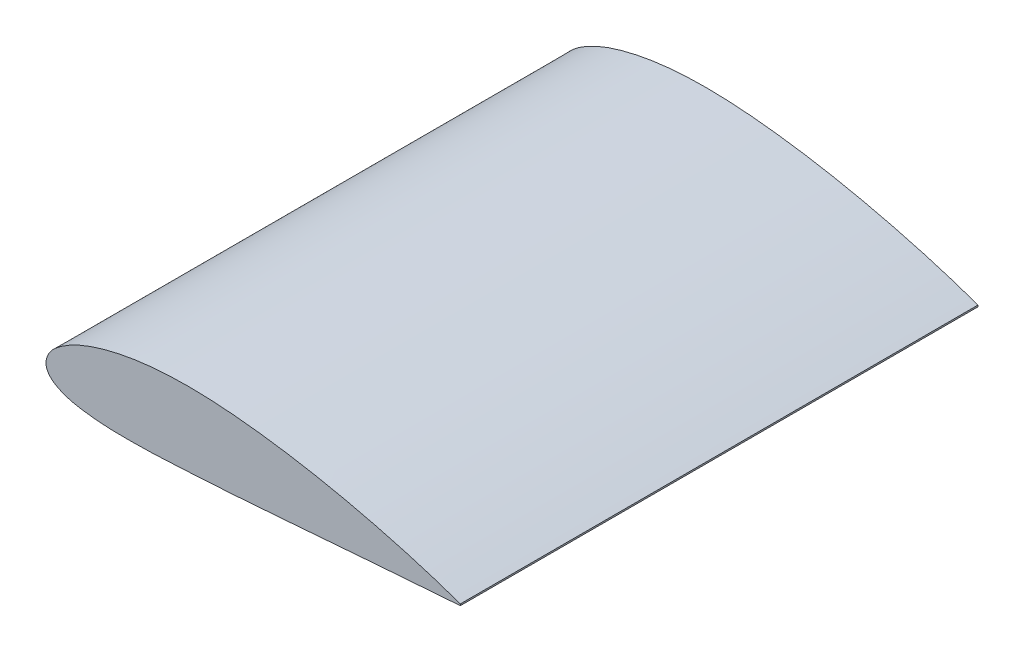
ISO-10303-21;
HEADER;
FILE_DESCRIPTION(('STEP AP214'),'2;1');
FILE_NAME('part.step','',(''),(''),'','','');
FILE_SCHEMA(('AUTOMOTIVE_DESIGN { 1 0 10303 214 1 1 1 1 }'));
ENDSEC;
DATA;
#1=APPLICATION_CONTEXT('core data for automotive mechanical design processes');
#2=APPLICATION_PROTOCOL_DEFINITION('international standard','automotive_design',2000,#1);
#3=PRODUCT_CONTEXT('',#1,'mechanical');
#4=PRODUCT('Part','Part','',(#3));
#5=PRODUCT_RELATED_PRODUCT_CATEGORY('part','',(#4));
#6=PRODUCT_DEFINITION_FORMATION('','',#4);
#7=PRODUCT_DEFINITION_CONTEXT('part definition',#1,'design');
#8=PRODUCT_DEFINITION('design','',#6,#7);
#9=PRODUCT_DEFINITION_SHAPE('','',#8);
#10=(LENGTH_UNIT() NAMED_UNIT(*) SI_UNIT(.MILLI.,.METRE.));
#11=(NAMED_UNIT(*) PLANE_ANGLE_UNIT() SI_UNIT($,.RADIAN.));
#12=(NAMED_UNIT(*) SI_UNIT($,.STERADIAN.) SOLID_ANGLE_UNIT());
#13=UNCERTAINTY_MEASURE_WITH_UNIT(LENGTH_MEASURE(1.E-05),#10,'distance_accuracy_value','');
#14=(GEOMETRIC_REPRESENTATION_CONTEXT(3) GLOBAL_UNCERTAINTY_ASSIGNED_CONTEXT((#13)) GLOBAL_UNIT_ASSIGNED_CONTEXT((#10,
#11,#12)) REPRESENTATION_CONTEXT('',''));
#15=CARTESIAN_POINT('',(0.,0.,0.));
#16=DIRECTION('',(0.,0.,1.));
#17=DIRECTION('',(1.,0.,0.));
#18=AXIS2_PLACEMENT_3D('',#15,#16,#17);
#19=CARTESIAN_POINT('',(100.,0.19,62.5));
#20=CARTESIAN_POINT('',(98.3360546419194,0.76484591452266,62.5));
#21=CARTESIAN_POINT('',(95.0208935644417,1.91014001454692,62.5));
#22=CARTESIAN_POINT('',(88.3728153631507,3.99119495998197,62.5));
#23=CARTESIAN_POINT('',(80.0503320648138,6.2750812076573,62.5));
#24=CARTESIAN_POINT('',(70.0445886554002,8.6136476352504,62.5));
#25=CARTESIAN_POINT('',(60.0386643804567,10.513538846848,62.5));
#26=CARTESIAN_POINT('',(50.0311040178423,11.9337905995866,62.5));
#27=CARTESIAN_POINT('',(40.0203446755458,12.8297283395815,62.5));
#28=CARTESIAN_POINT('',(31.6571382980835,12.9227163468173,62.5));
#29=CARTESIAN_POINT('',(24.9839241832814,12.4514246884447,62.5));
#30=CARTESIAN_POINT('',(19.9679673263382,11.7780132255189,62.5));
#31=CARTESIAN_POINT('',(14.9431956893952,10.7208152423679,62.5));
#32=CARTESIAN_POINT('',(10.7655921921213,9.46556819007456,62.5));
#33=CARTESIAN_POINT('',(7.45039380716086,8.07744812853414,62.5));
#34=CARTESIAN_POINT('',(4.90725257935843,6.76562454765211,62.5));
#35=CARTESIAN_POINT('',(2.78567518300562,5.31395587217279,62.5));
#36=CARTESIAN_POINT('',(0.678587456229065,3.3349382851458,62.5));
#37=CARTESIAN_POINT('',(-0.639700555191432,0.412131012393047,62.5));
#38=CARTESIAN_POINT('',(0.945805465840963,-2.01340442883506,62.5));
#39=CARTESIAN_POINT('',(2.81459736982895,-3.2367692079141,62.5));
#40=CARTESIAN_POINT('',(4.93387971444969,-4.11788448213044,62.5));
#41=CARTESIAN_POINT('',(7.48054281344165,-4.69867008328299,62.5));
#42=CARTESIAN_POINT('',(10.8179641055756,-5.20152468497258,62.5));
#43=CARTESIAN_POINT('',(14.9918712822611,-5.5599196034721,62.5));
#44=CARTESIAN_POINT('',(20.0002592854776,-5.56803006659069,62.5));
#45=CARTESIAN_POINT('',(25.0026998264743,-5.52793761176141,62.5));
#46=CARTESIAN_POINT('',(31.6681658450513,-5.17040107759097,62.5));
#47=CARTESIAN_POINT('',(40.0038115202688,-4.72505180246446,62.5));
#48=CARTESIAN_POINT('',(50.0039551460834,-4.03907277443699,62.5));
#49=CARTESIAN_POINT('',(60.0000387739362,-3.23720633833052,62.5));
#50=CARTESIAN_POINT('',(69.9998690866409,-2.45178374687352,62.5));
#51=CARTESIAN_POINT('',(79.9979173357133,-1.65586237855998,62.5));
#52=CARTESIAN_POINT('',(88.3343600440769,-1.06371301076697,62.5));
#53=CARTESIAN_POINT('',(94.9990695877566,-0.544106165645998,62.5));
#54=CARTESIAN_POINT('',(98.3331867825825,-0.308023805294868,62.5));
#55=CARTESIAN_POINT('',(100.,-0.19,62.5));
#56=B_SPLINE_CURVE_WITH_KNOTS('',3,(#19,#20,#21,#22,#23,#24,#25,#26,#27,#28,#29,#30,#31,#32,#33,
#34,#35,#36,#37,#38,#39,#40,#41,#42,#43,#44,#45,#46,#47,#48,#49,#50,#51,#52,#53,#54,#55),
.UNSPECIFIED.,.F.,.F.,(4,1,1,1,1,1,1,1,1,1,1,1,1,1,1,1,1,1,1,1,1,1,1,1,1,1,1,1,1,1,1,1,1,1,4),
(0.,0.0253650887246445,0.0505361275587217,0.100361870134764,0.149678338251287,0.198558599638479,
0.247063640993935,0.295266786262708,0.34329760014287,0.367374741168208,0.391610788770833,
0.416159496837379,0.441301925227276,0.454325483129524,0.467881590674856,0.482538596873547,
0.490995278488938,0.510026354241119,0.521805546317329,0.529147847458602,0.542208903153752,
0.554568661965215,0.566721378147277,0.590824996597648,0.614842324624285,0.638859652650922,
0.662900021742007,0.711005223100047,0.759146089619428,0.807321924518754,0.855501518205133,
0.903677353104459,0.951838628914161,0.975922858974662,1.),.UNSPECIFIED.);
#57=DIRECTION('',(0.,0.,-1.));
#58=VECTOR('',#57,1.);
#59=SURFACE_OF_LINEAR_EXTRUSION('',#56,#58);
#60=CARTESIAN_POINT('',(100.,0.19,-62.5));
#61=CARTESIAN_POINT('',(98.3360546419194,0.76484591452266,-62.5));
#62=CARTESIAN_POINT('',(95.0208935644417,1.91014001454692,-62.5));
#63=CARTESIAN_POINT('',(88.3728153631507,3.99119495998197,-62.5));
#64=CARTESIAN_POINT('',(80.0503320648138,6.2750812076573,-62.5));
#65=CARTESIAN_POINT('',(70.0445886554002,8.6136476352504,-62.5));
#66=CARTESIAN_POINT('',(60.0386643804567,10.513538846848,-62.5));
#67=CARTESIAN_POINT('',(50.0311040178423,11.9337905995866,-62.5));
#68=CARTESIAN_POINT('',(40.0203446755458,12.8297283395815,-62.5));
#69=CARTESIAN_POINT('',(31.6571382980835,12.9227163468173,-62.5));
#70=CARTESIAN_POINT('',(24.9839241832814,12.4514246884447,-62.5));
#71=CARTESIAN_POINT('',(19.9679673263382,11.7780132255189,-62.5));
#72=CARTESIAN_POINT('',(14.9431956893952,10.7208152423679,-62.5));
#73=CARTESIAN_POINT('',(10.7655921921213,9.46556819007456,-62.5));
#74=CARTESIAN_POINT('',(7.45039380716086,8.07744812853414,-62.5));
#75=CARTESIAN_POINT('',(4.90725257935843,6.76562454765211,-62.5));
#76=CARTESIAN_POINT('',(2.78567518300562,5.31395587217279,-62.5));
#77=CARTESIAN_POINT('',(0.678587456229065,3.3349382851458,-62.5));
#78=CARTESIAN_POINT('',(-0.639700555191432,0.412131012393047,-62.5));
#79=CARTESIAN_POINT('',(0.945805465840963,-2.01340442883506,-62.5));
#80=CARTESIAN_POINT('',(2.81459736982895,-3.2367692079141,-62.5));
#81=CARTESIAN_POINT('',(4.93387971444969,-4.11788448213044,-62.5));
#82=CARTESIAN_POINT('',(7.48054281344165,-4.69867008328299,-62.5));
#83=CARTESIAN_POINT('',(10.8179641055756,-5.20152468497258,-62.5));
#84=CARTESIAN_POINT('',(14.9918712822611,-5.5599196034721,-62.5));
#85=CARTESIAN_POINT('',(20.0002592854776,-5.56803006659069,-62.5));
#86=CARTESIAN_POINT('',(25.0026998264743,-5.52793761176141,-62.5));
#87=CARTESIAN_POINT('',(31.6681658450513,-5.17040107759097,-62.5));
#88=CARTESIAN_POINT('',(40.0038115202688,-4.72505180246446,-62.5));
#89=CARTESIAN_POINT('',(50.0039551460834,-4.03907277443699,-62.5));
#90=CARTESIAN_POINT('',(60.0000387739362,-3.23720633833052,-62.5));
#91=CARTESIAN_POINT('',(69.9998690866409,-2.45178374687352,-62.5));
#92=CARTESIAN_POINT('',(79.9979173357133,-1.65586237855998,-62.5));
#93=CARTESIAN_POINT('',(88.3343600440769,-1.06371301076697,-62.5));
#94=CARTESIAN_POINT('',(94.9990695877566,-0.544106165645998,-62.5));
#95=CARTESIAN_POINT('',(98.3331867825825,-0.308023805294868,-62.5));
#96=CARTESIAN_POINT('',(100.,-0.19,-62.5));
#97=B_SPLINE_CURVE_WITH_KNOTS('',3,(#60,#61,#62,#63,#64,#65,#66,#67,#68,#69,#70,#71,#72,#73,#74,
#75,#76,#77,#78,#79,#80,#81,#82,#83,#84,#85,#86,#87,#88,#89,#90,#91,#92,#93,#94,#95,#96),
.UNSPECIFIED.,.F.,.F.,(4,1,1,1,1,1,1,1,1,1,1,1,1,1,1,1,1,1,1,1,1,1,1,1,1,1,1,1,1,1,1,1,1,1,4),
(0.,0.0253650887246445,0.0505361275587217,0.100361870134764,0.149678338251287,0.198558599638479,
0.247063640993935,0.295266786262708,0.34329760014287,0.367374741168208,0.391610788770833,
0.416159496837379,0.441301925227276,0.454325483129524,0.467881590674856,0.482538596873547,
0.490995278488938,0.510026354241119,0.521805546317329,0.529147847458602,0.542208903153752,
0.554568661965215,0.566721378147277,0.590824996597648,0.614842324624285,0.638859652650922,
0.662900021742007,0.711005223100047,0.759146089619428,0.807321924518754,0.855501518205133,
0.903677353104459,0.951838628914161,0.975922858974662,1.),.UNSPECIFIED.);
#98=CARTESIAN_POINT('',(100.,0.19,-62.5));
#99=VERTEX_POINT('',#98);
#100=CARTESIAN_POINT('',(100.,-0.19,-62.5));
#101=VERTEX_POINT('',#100);
#102=EDGE_CURVE('E74',#99,#101,#97,.T.);
#103=ORIENTED_EDGE('',*,*,#102,.T.);
#104=DIRECTION('',(0.,0.,-1.));
#105=VECTOR('',#104,1.);
#106=CARTESIAN_POINT('',(100.,-0.19,62.5));
#107=LINE('',#106,#105);
#108=CARTESIAN_POINT('',(100.,-0.19,62.5));
#109=VERTEX_POINT('',#108);
#110=EDGE_CURVE('E11',#109,#101,#107,.T.);
#111=ORIENTED_EDGE('',*,*,#110,.F.);
#112=CARTESIAN_POINT('',(100.,0.19,62.5));
#113=VERTEX_POINT('',#112);
#114=EDGE_CURVE('E72',#113,#109,#56,.T.);
#115=ORIENTED_EDGE('',*,*,#114,.F.);
#116=DIRECTION('',(0.,0.,-1.));
#117=VECTOR('',#116,1.);
#118=CARTESIAN_POINT('',(100.,0.19,62.5));
#119=LINE('',#118,#117);
#120=EDGE_CURVE('E49',#113,#99,#119,.T.);
#121=ORIENTED_EDGE('',*,*,#120,.T.);
#122=EDGE_LOOP('',(#103,#111,#115,#121));
#123=FACE_BOUND('',#122,.T.);
#124=ADVANCED_FACE('F41',(#123),#59,.F.);
#125=CARTESIAN_POINT('',(100.,0.19,62.5));
#126=DIRECTION('',(-1.,0.,0.));
#127=DIRECTION('',(0.,0.,1.));
#128=AXIS2_PLACEMENT_3D('',#125,#126,#127);
#129=PLANE('',#128);
#130=DIRECTION('',(0.,1.,0.));
#131=VECTOR('',#130,1.);
#132=CARTESIAN_POINT('',(100.,0.19,-62.5));
#133=LINE('',#132,#131);
#134=EDGE_CURVE('E61',#101,#99,#133,.T.);
#135=ORIENTED_EDGE('',*,*,#134,.T.);
#136=ORIENTED_EDGE('',*,*,#120,.F.);
#137=DIRECTION('',(0.,1.,0.));
#138=VECTOR('',#137,1.);
#139=CARTESIAN_POINT('',(100.,0.19,62.5));
#140=LINE('',#139,#138);
#141=EDGE_CURVE('E60',#109,#113,#140,.T.);
#142=ORIENTED_EDGE('',*,*,#141,.F.);
#143=ORIENTED_EDGE('',*,*,#110,.T.);
#144=EDGE_LOOP('',(#135,#136,#142,#143));
#145=FACE_BOUND('',#144,.T.);
#146=ADVANCED_FACE('F69',(#145),#129,.F.);
#147=CARTESIAN_POINT('',(0.251862902669803,2.07183778007467,62.5));
#148=DIRECTION('',(0.,0.,-1.));
#149=DIRECTION('',(-1.,0.,0.));
#150=AXIS2_PLACEMENT_3D('',#147,#148,#149);
#151=PLANE('',#150);
#152=ORIENTED_EDGE('',*,*,#114,.T.);
#153=ORIENTED_EDGE('',*,*,#141,.T.);
#154=EDGE_LOOP('',(#152,#153));
#155=FACE_BOUND('',#154,.T.);
#156=ADVANCED_FACE('F89',(#155),#151,.F.);
#157=CARTESIAN_POINT('',(0.251862902669803,2.07183778007467,-62.5));
#158=DIRECTION('',(0.,0.,-1.));
#159=DIRECTION('',(-1.,0.,0.));
#160=AXIS2_PLACEMENT_3D('',#157,#158,#159);
#161=PLANE('',#160);
#162=ORIENTED_EDGE('',*,*,#102,.F.);
#163=ORIENTED_EDGE('',*,*,#134,.F.);
#164=EDGE_LOOP('',(#162,#163));
#165=FACE_BOUND('',#164,.T.);
#166=ADVANCED_FACE('F77',(#165),#161,.T.);
#167=CLOSED_SHELL('',(#124,#146,#156,#166));
#168=MANIFOLD_SOLID_BREP('B2',#167);
#169=ADVANCED_BREP_SHAPE_REPRESENTATION('',(#18,#168),#14);
#170=SHAPE_DEFINITION_REPRESENTATION(#9,#169);
ENDSEC;
END-ISO-10303-21;
